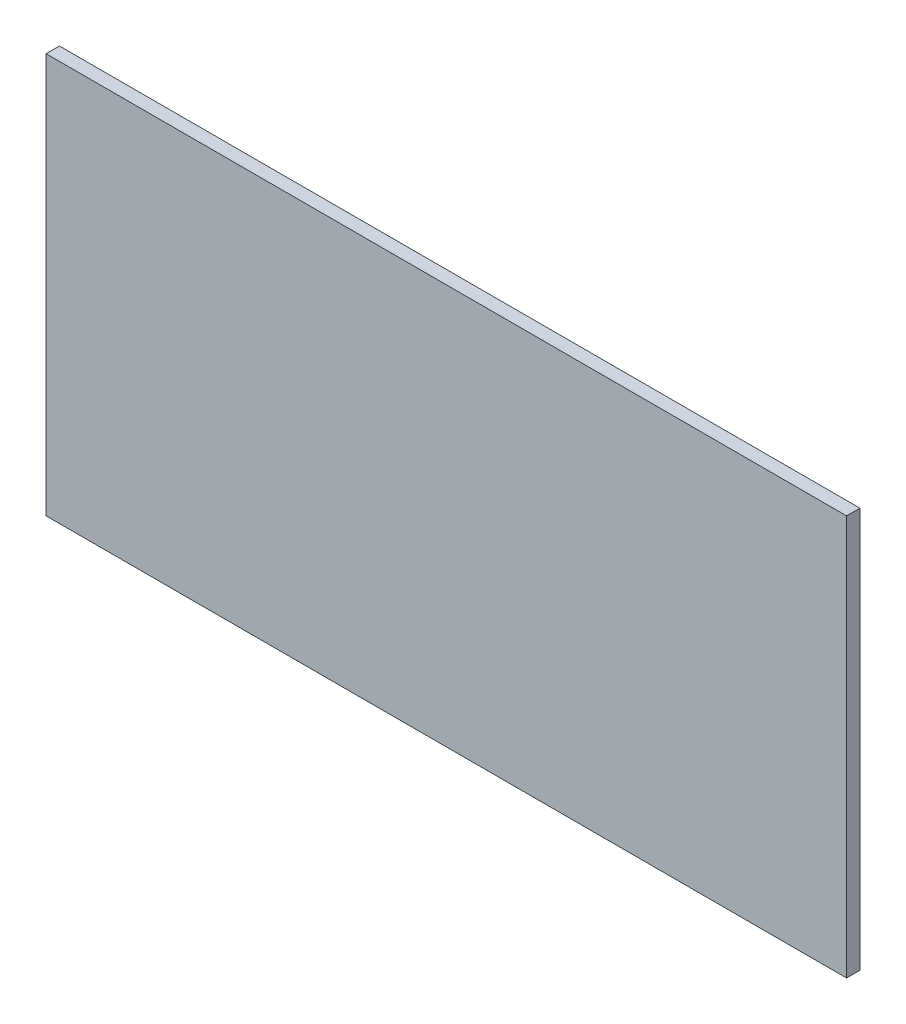
ISO-10303-21;
HEADER;
FILE_DESCRIPTION(('STEP AP214'),'2;1');
FILE_NAME('part.step','',(''),(''),'','','');
FILE_SCHEMA(('AUTOMOTIVE_DESIGN { 1 0 10303 214 1 1 1 1 }'));
ENDSEC;
DATA;
#1=APPLICATION_CONTEXT('core data for automotive mechanical design processes');
#2=APPLICATION_PROTOCOL_DEFINITION('international standard','automotive_design',2000,#1);
#3=PRODUCT_CONTEXT('',#1,'mechanical');
#4=PRODUCT('Part','Part','',(#3));
#5=PRODUCT_RELATED_PRODUCT_CATEGORY('part','',(#4));
#6=PRODUCT_DEFINITION_FORMATION('','',#4);
#7=PRODUCT_DEFINITION_CONTEXT('part definition',#1,'design');
#8=PRODUCT_DEFINITION('design','',#6,#7);
#9=PRODUCT_DEFINITION_SHAPE('','',#8);
#10=(LENGTH_UNIT() NAMED_UNIT(*) SI_UNIT(.MILLI.,.METRE.));
#11=(NAMED_UNIT(*) PLANE_ANGLE_UNIT() SI_UNIT($,.RADIAN.));
#12=(NAMED_UNIT(*) SI_UNIT($,.STERADIAN.) SOLID_ANGLE_UNIT());
#13=UNCERTAINTY_MEASURE_WITH_UNIT(LENGTH_MEASURE(1.E-05),#10,'distance_accuracy_value','');
#14=(GEOMETRIC_REPRESENTATION_CONTEXT(3) GLOBAL_UNCERTAINTY_ASSIGNED_CONTEXT((#13)) GLOBAL_UNIT_ASSIGNED_CONTEXT((#10,
#11,#12)) REPRESENTATION_CONTEXT('',''));
#15=CARTESIAN_POINT('',(0.,0.,0.));
#16=DIRECTION('',(0.,0.,1.));
#17=DIRECTION('',(1.,0.,0.));
#18=AXIS2_PLACEMENT_3D('',#15,#16,#17);
#19=CARTESIAN_POINT('',(60.,0.,-92.));
#20=DIRECTION('',(0.,1.,0.));
#21=DIRECTION('',(0.,0.,1.));
#22=AXIS2_PLACEMENT_3D('',#19,#20,#21);
#23=PLANE('',#22);
#24=DIRECTION('',(-1.,0.,0.));
#25=VECTOR('',#24,1.);
#26=CARTESIAN_POINT('',(60.,0.,-90.));
#27=LINE('',#26,#25);
#28=CARTESIAN_POINT('',(60.,0.,-90.));
#29=VERTEX_POINT('',#28);
#30=CARTESIAN_POINT('',(-60.,0.,-90.));
#31=VERTEX_POINT('',#30);
#32=EDGE_CURVE('E95',#29,#31,#27,.T.);
#33=ORIENTED_EDGE('',*,*,#32,.T.);
#34=DIRECTION('',(0.,0.,1.));
#35=VECTOR('',#34,1.);
#36=CARTESIAN_POINT('',(-60.,0.,-92.));
#37=LINE('',#36,#35);
#38=CARTESIAN_POINT('',(-60.,0.,-92.));
#39=VERTEX_POINT('',#38);
#40=EDGE_CURVE('E11',#39,#31,#37,.T.);
#41=ORIENTED_EDGE('',*,*,#40,.F.);
#42=DIRECTION('',(-1.,0.,0.));
#43=VECTOR('',#42,1.);
#44=CARTESIAN_POINT('',(60.,0.,-92.));
#45=LINE('',#44,#43);
#46=CARTESIAN_POINT('',(60.,0.,-92.));
#47=VERTEX_POINT('',#46);
#48=EDGE_CURVE('E81',#47,#39,#45,.T.);
#49=ORIENTED_EDGE('',*,*,#48,.F.);
#50=DIRECTION('',(0.,0.,1.));
#51=VECTOR('',#50,1.);
#52=CARTESIAN_POINT('',(60.,0.,-92.));
#53=LINE('',#52,#51);
#54=EDGE_CURVE('E48',#47,#29,#53,.T.);
#55=ORIENTED_EDGE('',*,*,#54,.T.);
#56=EDGE_LOOP('',(#33,#41,#49,#55));
#57=FACE_BOUND('',#56,.T.);
#58=ADVANCED_FACE('F32',(#57),#23,.F.);
#59=CARTESIAN_POINT('',(-60.,0.,-92.));
#60=DIRECTION('',(1.,0.,0.));
#61=DIRECTION('',(0.,0.,-1.));
#62=AXIS2_PLACEMENT_3D('',#59,#60,#61);
#63=PLANE('',#62);
#64=DIRECTION('',(0.,1.,0.));
#65=VECTOR('',#64,1.);
#66=CARTESIAN_POINT('',(-60.,0.,-90.));
#67=LINE('',#66,#65);
#68=CARTESIAN_POINT('',(-60.,60.,-90.));
#69=VERTEX_POINT('',#68);
#70=EDGE_CURVE('E86',#31,#69,#67,.T.);
#71=ORIENTED_EDGE('',*,*,#70,.T.);
#72=DIRECTION('',(0.,0.,1.));
#73=VECTOR('',#72,1.);
#74=CARTESIAN_POINT('',(-60.,60.,-92.));
#75=LINE('',#74,#73);
#76=CARTESIAN_POINT('',(-60.,60.,-92.));
#77=VERTEX_POINT('',#76);
#78=EDGE_CURVE('E40',#77,#69,#75,.T.);
#79=ORIENTED_EDGE('',*,*,#78,.F.);
#80=DIRECTION('',(0.,1.,0.));
#81=VECTOR('',#80,1.);
#82=CARTESIAN_POINT('',(-60.,0.,-92.));
#83=LINE('',#82,#81);
#84=EDGE_CURVE('E73',#39,#77,#83,.T.);
#85=ORIENTED_EDGE('',*,*,#84,.F.);
#86=ORIENTED_EDGE('',*,*,#40,.T.);
#87=EDGE_LOOP('',(#71,#79,#85,#86));
#88=FACE_BOUND('',#87,.T.);
#89=ADVANCED_FACE('F85',(#88),#63,.F.);
#90=CARTESIAN_POINT('',(60.,60.,-92.));
#91=DIRECTION('',(0.,1.,0.));
#92=DIRECTION('',(0.,0.,1.));
#93=AXIS2_PLACEMENT_3D('',#90,#91,#92);
#94=PLANE('',#93);
#95=DIRECTION('',(-1.,0.,0.));
#96=VECTOR('',#95,1.);
#97=CARTESIAN_POINT('',(60.,60.,-90.));
#98=LINE('',#97,#96);
#99=CARTESIAN_POINT('',(60.,60.,-90.));
#100=VERTEX_POINT('',#99);
#101=EDGE_CURVE('E98',#100,#69,#98,.T.);
#102=ORIENTED_EDGE('',*,*,#101,.F.);
#103=DIRECTION('',(0.,0.,1.));
#104=VECTOR('',#103,1.);
#105=CARTESIAN_POINT('',(60.,60.,-92.));
#106=LINE('',#105,#104);
#107=CARTESIAN_POINT('',(60.,60.,-92.));
#108=VERTEX_POINT('',#107);
#109=EDGE_CURVE('E62',#108,#100,#106,.T.);
#110=ORIENTED_EDGE('',*,*,#109,.F.);
#111=DIRECTION('',(-1.,0.,0.));
#112=VECTOR('',#111,1.);
#113=CARTESIAN_POINT('',(60.,60.,-92.));
#114=LINE('',#113,#112);
#115=EDGE_CURVE('E80',#108,#77,#114,.T.);
#116=ORIENTED_EDGE('',*,*,#115,.T.);
#117=ORIENTED_EDGE('',*,*,#78,.T.);
#118=EDGE_LOOP('',(#102,#110,#116,#117));
#119=FACE_BOUND('',#118,.T.);
#120=ADVANCED_FACE('F89',(#119),#94,.T.);
#121=CARTESIAN_POINT('',(60.,0.,-92.));
#122=DIRECTION('',(1.,0.,0.));
#123=DIRECTION('',(0.,0.,-1.));
#124=AXIS2_PLACEMENT_3D('',#121,#122,#123);
#125=PLANE('',#124);
#126=DIRECTION('',(0.,1.,0.));
#127=VECTOR('',#126,1.);
#128=CARTESIAN_POINT('',(60.,0.,-90.));
#129=LINE('',#128,#127);
#130=EDGE_CURVE('E100',#29,#100,#129,.T.);
#131=ORIENTED_EDGE('',*,*,#130,.F.);
#132=ORIENTED_EDGE('',*,*,#54,.F.);
#133=DIRECTION('',(0.,1.,0.));
#134=VECTOR('',#133,1.);
#135=CARTESIAN_POINT('',(60.,0.,-92.));
#136=LINE('',#135,#134);
#137=EDGE_CURVE('E90',#47,#108,#136,.T.);
#138=ORIENTED_EDGE('',*,*,#137,.T.);
#139=ORIENTED_EDGE('',*,*,#109,.T.);
#140=EDGE_LOOP('',(#131,#132,#138,#139));
#141=FACE_BOUND('',#140,.T.);
#142=ADVANCED_FACE('F106',(#141),#125,.T.);
#143=CARTESIAN_POINT('',(0.,0.,-92.));
#144=DIRECTION('',(0.,0.,-1.));
#145=DIRECTION('',(-1.,0.,0.));
#146=AXIS2_PLACEMENT_3D('',#143,#144,#145);
#147=PLANE('',#146);
#148=ORIENTED_EDGE('',*,*,#48,.T.);
#149=ORIENTED_EDGE('',*,*,#84,.T.);
#150=ORIENTED_EDGE('',*,*,#115,.F.);
#151=ORIENTED_EDGE('',*,*,#137,.F.);
#152=EDGE_LOOP('',(#148,#149,#150,#151));
#153=FACE_BOUND('',#152,.T.);
#154=ADVANCED_FACE('F77',(#153),#147,.T.);
#155=CARTESIAN_POINT('',(0.,0.,-90.));
#156=DIRECTION('',(0.,0.,-1.));
#157=DIRECTION('',(-1.,0.,0.));
#158=AXIS2_PLACEMENT_3D('',#155,#156,#157);
#159=PLANE('',#158);
#160=ORIENTED_EDGE('',*,*,#32,.F.);
#161=ORIENTED_EDGE('',*,*,#130,.T.);
#162=ORIENTED_EDGE('',*,*,#101,.T.);
#163=ORIENTED_EDGE('',*,*,#70,.F.);
#164=EDGE_LOOP('',(#160,#161,#162,#163));
#165=FACE_BOUND('',#164,.T.);
#166=ADVANCED_FACE('F105',(#165),#159,.F.);
#167=CLOSED_SHELL('',(#58,#89,#120,#142,#154,#166));
#168=MANIFOLD_SOLID_BREP('B2',#167);
#169=ADVANCED_BREP_SHAPE_REPRESENTATION('',(#18,#168),#14);
#170=SHAPE_DEFINITION_REPRESENTATION(#9,#169);
ENDSEC;
END-ISO-10303-21;
